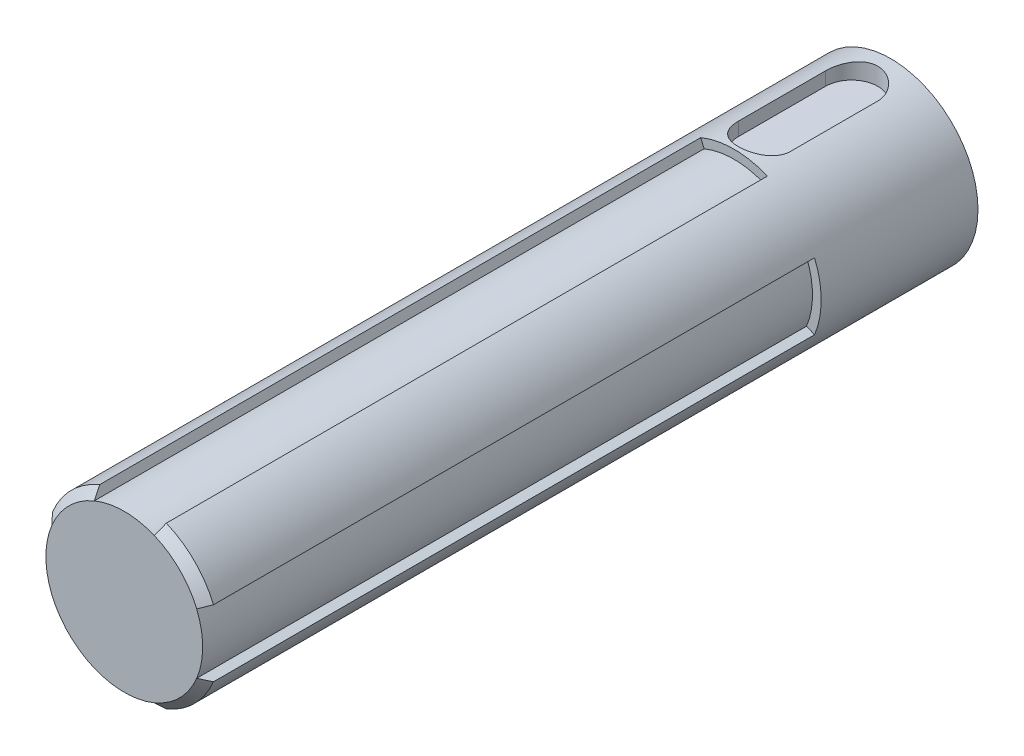
ISO-10303-21;
HEADER;
FILE_DESCRIPTION(('STEP AP214'),'2;1');
FILE_NAME('part.step','',(''),(''),'','','');
FILE_SCHEMA(('AUTOMOTIVE_DESIGN { 1 0 10303 214 1 1 1 1 }'));
ENDSEC;
DATA;
#1=APPLICATION_CONTEXT('core data for automotive mechanical design processes');
#2=APPLICATION_PROTOCOL_DEFINITION('international standard','automotive_design',2000,#1);
#3=PRODUCT_CONTEXT('',#1,'mechanical');
#4=PRODUCT('Part','Part','',(#3));
#5=PRODUCT_RELATED_PRODUCT_CATEGORY('part','',(#4));
#6=PRODUCT_DEFINITION_FORMATION('','',#4);
#7=PRODUCT_DEFINITION_CONTEXT('part definition',#1,'design');
#8=PRODUCT_DEFINITION('design','',#6,#7);
#9=PRODUCT_DEFINITION_SHAPE('','',#8);
#10=(LENGTH_UNIT() NAMED_UNIT(*) SI_UNIT(.MILLI.,.METRE.));
#11=(NAMED_UNIT(*) PLANE_ANGLE_UNIT() SI_UNIT($,.RADIAN.));
#12=(NAMED_UNIT(*) SI_UNIT($,.STERADIAN.) SOLID_ANGLE_UNIT());
#13=UNCERTAINTY_MEASURE_WITH_UNIT(LENGTH_MEASURE(1.E-05),#10,'distance_accuracy_value','');
#14=(GEOMETRIC_REPRESENTATION_CONTEXT(3) GLOBAL_UNCERTAINTY_ASSIGNED_CONTEXT((#13)) GLOBAL_UNIT_ASSIGNED_CONTEXT((#10,
#11,#12)) REPRESENTATION_CONTEXT('',''));
#15=CARTESIAN_POINT('',(0.,0.,0.));
#16=DIRECTION('',(0.,0.,1.));
#17=DIRECTION('',(1.,0.,0.));
#18=AXIS2_PLACEMENT_3D('',#15,#16,#17);
#19=CARTESIAN_POINT('',(0.,0.,88.));
#20=DIRECTION('',(0.,0.,-1.));
#21=DIRECTION('',(-1.,0.,0.));
#22=AXIS2_PLACEMENT_3D('',#19,#20,#21);
#23=CYLINDRICAL_SURFACE('',#22,10.);
#24=DIRECTION('',(0.,0.,-1.));
#25=VECTOR('',#24,1.);
#26=CARTESIAN_POINT('',(-3.,9.53939201416945,88.));
#27=LINE('',#26,#25);
#28=CARTESIAN_POINT('',(-3.,9.53939201416945,14.5));
#29=VERTEX_POINT('',#28);
#30=CARTESIAN_POINT('',(-3.,9.53939201416945,4.5));
#31=VERTEX_POINT('',#30);
#32=EDGE_CURVE('E11',#29,#31,#27,.T.);
#33=ORIENTED_EDGE('',*,*,#32,.T.);
#34=CARTESIAN_POINT('',(-3.,9.53939201416945,4.5));
#35=CARTESIAN_POINT('',(-3.00001027845728,9.53938054248206,4.4176644791773));
#36=CARTESIAN_POINT('',(-2.99661062684472,9.54045772064378,4.33533554493678));
#37=CARTESIAN_POINT('',(-2.98307142899347,9.54470412105986,4.17130604723454));
#38=CARTESIAN_POINT('',(-2.97293339805418,9.54787287296848,4.08960534667564));
#39=CARTESIAN_POINT('',(-2.94603140625045,9.55620668351003,3.92761508432682));
#40=CARTESIAN_POINT('',(-2.92928426957737,9.56136667250114,3.84732247595697));
#41=CARTESIAN_POINT('',(-2.88932853030395,9.57351626651178,3.68852415586577));
#42=CARTESIAN_POINT('',(-2.86611975872641,9.58050591937827,3.6100184909326));
#43=CARTESIAN_POINT('',(-2.78708584446024,9.60391637654136,3.37805061200985));
#44=CARTESIAN_POINT('',(-2.72181852542972,9.6227900783039,3.22793156116698));
#45=CARTESIAN_POINT('',(-2.56815043531276,9.66493213967819,2.94077395602096));
#46=CARTESIAN_POINT('',(-2.4797388992416,9.6882025429064,2.80374152923783));
#47=CARTESIAN_POINT('',(-2.27929879634442,9.73733650515374,2.54227701205217));
#48=CARTESIAN_POINT('',(-2.16666914746584,9.76325505469874,2.41831512593909));
#49=CARTESIAN_POINT('',(-1.92227736150433,9.81429628475077,2.19072638516124));
#50=CARTESIAN_POINT('',(-1.79051199848164,9.8394188301941,2.08710296613899));
#51=CARTESIAN_POINT('',(-1.50821997465697,9.88666477976534,1.90107313490544));
#52=CARTESIAN_POINT('',(-1.35736167401016,9.90871541546877,1.81914982021738));
#53=CARTESIAN_POINT('',(-1.04324233568303,9.94668940088144,1.68202299599707));
#54=CARTESIAN_POINT('',(-0.879984508687984,9.96261433032402,1.62681259663205));
#55=CARTESIAN_POINT('',(-0.550649404820601,9.98615279768397,1.546240448209));
#56=CARTESIAN_POINT('',(-0.384786253016203,9.99399098526792,1.52007029648238));
#57=CARTESIAN_POINT('',(-0.0508471415689274,10.0012640407204,1.49576530485396));
#58=CARTESIAN_POINT('',(0.11722839312534,10.0007004995012,1.49762515732182));
#59=CARTESIAN_POINT('',(0.445143199271825,9.99139205125586,1.52878582069144));
#60=CARTESIAN_POINT('',(0.605074290763029,9.98290831016512,1.55721069080811));
#61=CARTESIAN_POINT('',(0.917780104370314,9.95903027401822,1.63926326962549));
#62=CARTESIAN_POINT('',(1.07055445110879,9.94363561692558,1.69289229868267));
#63=CARTESIAN_POINT('',(1.36669563173912,9.90730429851782,1.82442444352475));
#64=CARTESIAN_POINT('',(1.50993201207613,9.88630511384915,1.9026032887761));
#65=CARTESIAN_POINT('',(1.781531059161,9.84099249303646,2.0807971800344));
#66=CARTESIAN_POINT('',(1.9098903832325,9.81667831471806,2.1808171189407));
#67=CARTESIAN_POINT('',(2.15330901082205,9.7662334714278,2.40438397618464));
#68=CARTESIAN_POINT('',(2.26766702955975,9.74006890899097,2.52868772752621));
#69=CARTESIAN_POINT('',(2.47413538985067,9.68968430229327,2.79499484685111));
#70=CARTESIAN_POINT('',(2.5662392402618,9.66546482675133,2.93700336072978));
#71=CARTESIAN_POINT('',(2.72632814481701,9.62154457591303,3.23656185689986));
#72=CARTESIAN_POINT('',(2.79406012682263,9.60189192491895,3.39425435918714));
#73=CARTESIAN_POINT('',(2.90171772009404,9.56991327306402,3.71944900796315));
#74=CARTESIAN_POINT('',(2.94168586436072,9.55757606951749,3.88693572142869));
#75=CARTESIAN_POINT('',(2.97802407180159,9.54628064650011,4.1299897781404));
#76=CARTESIAN_POINT('',(2.98626405978017,9.54370312550533,4.20378146835922));
#77=CARTESIAN_POINT('',(2.99724711229708,9.54025857223564,4.35170295819904));
#78=CARTESIAN_POINT('',(2.99999825936538,9.53938902493287,4.42583209932769));
#79=CARTESIAN_POINT('',(3.,9.53939201416945,4.5));
#80=B_SPLINE_CURVE_WITH_KNOTS('',3,(#34,#35,#36,#37,#38,#39,#40,#41,#42,#43,#44,#45,#46,#47,#48,
#49,#50,#51,#52,#53,#54,#55,#56,#57,#58,#59,#60,#61,#62,#63,#64,#65,#66,#67,#68,#69,#70,#71,#72,
#73,#74,#75,#76,#77,#78,#79),.UNSPECIFIED.,.F.,.F.,(4,2,2,2,2,2,2,2,2,2,2,2,2,2,2,2,2,2,2,2,2,2,
4),(0.,0.246918142439468,0.493780777706086,0.740019009623011,0.986263681482025,1.47813347402025,
1.97023245590779,2.47635119822766,2.98255536239033,3.4992281062007,4.01576751791672,
4.51753600864764,5.01920948804101,5.50490358251093,5.99062312360831,6.48200583350621,
6.97349873739169,7.48389234847122,7.99443465298715,8.51013494368214,9.02504345105574,
9.24774267716777,9.47011372732391),.UNSPECIFIED.);
#81=CARTESIAN_POINT('',(3.,9.53939201416945,4.5));
#82=VERTEX_POINT('',#81);
#83=EDGE_CURVE('E329',#31,#82,#80,.T.);
#84=ORIENTED_EDGE('',*,*,#83,.T.);
#85=DIRECTION('',(0.,0.,-1.));
#86=VECTOR('',#85,1.);
#87=CARTESIAN_POINT('',(3.,9.53939201416945,88.));
#88=LINE('',#87,#86);
#89=CARTESIAN_POINT('',(3.,9.53939201416945,14.5));
#90=VERTEX_POINT('',#89);
#91=EDGE_CURVE('E43',#82,#90,#88,.F.);
#92=ORIENTED_EDGE('',*,*,#91,.T.);
#93=CARTESIAN_POINT('',(3.,9.53939201416945,14.5));
#94=CARTESIAN_POINT('',(3.00001027845728,9.53938054248206,14.5823355208227));
#95=CARTESIAN_POINT('',(2.99661062684472,9.54045772064378,14.6646644550632));
#96=CARTESIAN_POINT('',(2.98307142899347,9.54470412105986,14.8286939527655));
#97=CARTESIAN_POINT('',(2.97293339805418,9.54787287296848,14.9103946533244));
#98=CARTESIAN_POINT('',(2.94603140625045,9.55620668351003,15.0723849156732));
#99=CARTESIAN_POINT('',(2.92928426957737,9.56136667250114,15.152677524043));
#100=CARTESIAN_POINT('',(2.88932853030395,9.57351626651178,15.3114758441342));
#101=CARTESIAN_POINT('',(2.86611975872641,9.58050591937827,15.3899815090674));
#102=CARTESIAN_POINT('',(2.78708584446024,9.60391637654136,15.6219493879901));
#103=CARTESIAN_POINT('',(2.72181852542972,9.6227900783039,15.772068438833));
#104=CARTESIAN_POINT('',(2.56815043531276,9.66493213967819,16.059226043979));
#105=CARTESIAN_POINT('',(2.4797388992416,9.6882025429064,16.1962584707622));
#106=CARTESIAN_POINT('',(2.27929879634442,9.73733650515374,16.4577229879478));
#107=CARTESIAN_POINT('',(2.16666914746584,9.76325505469873,16.5816848740609));
#108=CARTESIAN_POINT('',(1.92227736150433,9.81429628475077,16.8092736148388));
#109=CARTESIAN_POINT('',(1.79051199848164,9.8394188301941,16.912897033861));
#110=CARTESIAN_POINT('',(1.50821997465697,9.88666477976534,17.0989268650946));
#111=CARTESIAN_POINT('',(1.35736167401016,9.90871541546877,17.1808501797826));
#112=CARTESIAN_POINT('',(1.04324233568303,9.94668940088144,17.3179770040029));
#113=CARTESIAN_POINT('',(0.879984508687985,9.96261433032402,17.3731874033679));
#114=CARTESIAN_POINT('',(0.550649404820602,9.98615279768397,17.453759551791));
#115=CARTESIAN_POINT('',(0.384786253016203,9.99399098526792,17.4799297035176));
#116=CARTESIAN_POINT('',(0.0508471415689279,10.0012640407204,17.504234695146));
#117=CARTESIAN_POINT('',(-0.117228393125339,10.0007004995012,17.5023748426782));
#118=CARTESIAN_POINT('',(-0.445143199271824,9.99139205125586,17.4712141793086));
#119=CARTESIAN_POINT('',(-0.605074290763027,9.98290831016512,17.4427893091919));
#120=CARTESIAN_POINT('',(-0.917780104370312,9.95903027401822,17.3607367303745));
#121=CARTESIAN_POINT('',(-1.07055445110879,9.94363561692558,17.3071077013173));
#122=CARTESIAN_POINT('',(-1.36669563173912,9.90730429851782,17.1755755564753));
#123=CARTESIAN_POINT('',(-1.50993201207612,9.88630511384915,17.0973967112239));
#124=CARTESIAN_POINT('',(-1.781531059161,9.84099249303646,16.9192028199656));
#125=CARTESIAN_POINT('',(-1.9098903832325,9.81667831471806,16.8191828810593));
#126=CARTESIAN_POINT('',(-2.15330901082205,9.7662334714278,16.5956160238154));
#127=CARTESIAN_POINT('',(-2.26766702955975,9.74006890899097,16.4713122724738));
#128=CARTESIAN_POINT('',(-2.47413538985067,9.68968430229327,16.2050051531489));
#129=CARTESIAN_POINT('',(-2.5662392402618,9.66546482675134,16.0629966392702));
#130=CARTESIAN_POINT('',(-2.72632814481701,9.62154457591303,15.7634381431001));
#131=CARTESIAN_POINT('',(-2.79406012682262,9.60189192491895,15.6057456408129));
#132=CARTESIAN_POINT('',(-2.90171772009404,9.56991327306402,15.2805509920369));
#133=CARTESIAN_POINT('',(-2.94168586436072,9.55757606951749,15.1130642785713));
#134=CARTESIAN_POINT('',(-2.97802407180159,9.54628064650011,14.8700102218596));
#135=CARTESIAN_POINT('',(-2.98626405978017,9.54370312550533,14.7962185316408));
#136=CARTESIAN_POINT('',(-2.99724711229708,9.54025857223564,14.648297041801));
#137=CARTESIAN_POINT('',(-2.99999825936538,9.53938902493288,14.5741679006723));
#138=CARTESIAN_POINT('',(-3.,9.53939201416945,14.5));
#139=B_SPLINE_CURVE_WITH_KNOTS('',3,(#93,#94,#95,#96,#97,#98,#99,#100,#101,#102,#103,#104,#105,
#106,#107,#108,#109,#110,#111,#112,#113,#114,#115,#116,#117,#118,#119,#120,#121,#122,#123,#124,
#125,#126,#127,#128,#129,#130,#131,#132,#133,#134,#135,#136,#137,#138),.UNSPECIFIED.,.F.,.F.,(4,
2,2,2,2,2,2,2,2,2,2,2,2,2,2,2,2,2,2,2,2,2,4),(0.,0.246918142439467,0.493780777706085,
0.740019009623012,0.986263681482025,1.47813347402025,1.97023245590779,2.47635119822766,
2.98255536239033,3.4992281062007,4.01576751791672,4.51753600864764,5.01920948804101,
5.50490358251092,5.99062312360831,6.48200583350621,6.97349873739169,7.48389234847122,
7.99443465298715,8.51013494368214,9.02504345105574,9.24774267716777,9.47011372732391),.UNSPECIFIED.);
#140=EDGE_CURVE('E50',#90,#29,#139,.T.);
#141=ORIENTED_EDGE('',*,*,#140,.T.);
#142=EDGE_LOOP('',(#33,#84,#92,#141));
#143=FACE_BOUND('',#142,.T.);
#144=CARTESIAN_POINT('',(0.,0.,18.));
#145=DIRECTION('',(0.,0.,1.));
#146=DIRECTION('',(1.,0.,0.));
#147=AXIS2_PLACEMENT_3D('',#144,#145,#146);
#148=CIRCLE('',#147,10.);
#149=CARTESIAN_POINT('',(9.23879532511286,-3.8268343236509,18.));
#150=VERTEX_POINT('',#149);
#151=CARTESIAN_POINT('',(9.23879532511286,3.8268343236509,18.));
#152=VERTEX_POINT('',#151);
#153=EDGE_CURVE('E208',#150,#152,#148,.T.);
#154=ORIENTED_EDGE('',*,*,#153,.F.);
#155=DIRECTION('',(0.,0.,1.));
#156=VECTOR('',#155,1.);
#157=CARTESIAN_POINT('',(9.23879532511286,-3.8268343236509,18.));
#158=LINE('',#157,#156);
#159=CARTESIAN_POINT('',(9.23879532511286,-3.8268343236509,87.));
#160=VERTEX_POINT('',#159);
#161=EDGE_CURVE('E216',#150,#160,#158,.T.);
#162=ORIENTED_EDGE('',*,*,#161,.T.);
#163=CARTESIAN_POINT('',(0.,0.,87.));
#164=DIRECTION('',(0.,0.,1.));
#165=DIRECTION('',(1.,0.,0.));
#166=AXIS2_PLACEMENT_3D('',#163,#164,#165);
#167=CIRCLE('',#166,10.);
#168=CARTESIAN_POINT('',(3.82683432365084,-9.23879532511289,87.));
#169=VERTEX_POINT('',#168);
#170=EDGE_CURVE('E307',#160,#169,#167,.F.);
#171=ORIENTED_EDGE('',*,*,#170,.T.);
#172=DIRECTION('',(0.,0.,1.));
#173=VECTOR('',#172,1.);
#174=CARTESIAN_POINT('',(3.82683432365084,-9.23879532511289,18.));
#175=LINE('',#174,#173);
#176=CARTESIAN_POINT('',(3.82683432365084,-9.23879532511289,18.));
#177=VERTEX_POINT('',#176);
#178=EDGE_CURVE('E248',#177,#169,#175,.T.);
#179=ORIENTED_EDGE('',*,*,#178,.F.);
#180=CARTESIAN_POINT('',(0.,0.,18.));
#181=DIRECTION('',(0.,0.,1.));
#182=DIRECTION('',(1.,0.,0.));
#183=AXIS2_PLACEMENT_3D('',#180,#181,#182);
#184=CIRCLE('',#183,10.);
#185=CARTESIAN_POINT('',(-3.82683432365084,-9.23879532511289,18.));
#186=VERTEX_POINT('',#185);
#187=EDGE_CURVE('E231',#186,#177,#184,.T.);
#188=ORIENTED_EDGE('',*,*,#187,.F.);
#189=DIRECTION('',(0.,0.,1.));
#190=VECTOR('',#189,1.);
#191=CARTESIAN_POINT('',(-3.82683432365084,-9.23879532511289,18.));
#192=LINE('',#191,#190);
#193=CARTESIAN_POINT('',(-3.82683432365084,-9.23879532511289,87.));
#194=VERTEX_POINT('',#193);
#195=EDGE_CURVE('E240',#186,#194,#192,.T.);
#196=ORIENTED_EDGE('',*,*,#195,.T.);
#197=CARTESIAN_POINT('',(-9.23879532511286,-3.8268343236509,87.));
#198=VERTEX_POINT('',#197);
#199=EDGE_CURVE('E476',#194,#198,#167,.F.);
#200=ORIENTED_EDGE('',*,*,#199,.T.);
#201=DIRECTION('',(0.,0.,1.));
#202=VECTOR('',#201,1.);
#203=CARTESIAN_POINT('',(-9.23879532511286,-3.8268343236509,18.));
#204=LINE('',#203,#202);
#205=CARTESIAN_POINT('',(-9.23879532511286,-3.8268343236509,18.));
#206=VERTEX_POINT('',#205);
#207=EDGE_CURVE('E270',#206,#198,#204,.T.);
#208=ORIENTED_EDGE('',*,*,#207,.F.);
#209=CARTESIAN_POINT('',(0.,0.,18.));
#210=DIRECTION('',(0.,0.,1.));
#211=DIRECTION('',(1.,0.,0.));
#212=AXIS2_PLACEMENT_3D('',#209,#210,#211);
#213=CIRCLE('',#212,10.);
#214=CARTESIAN_POINT('',(-9.23879532511286,3.8268343236509,18.));
#215=VERTEX_POINT('',#214);
#216=EDGE_CURVE('E255',#215,#206,#213,.T.);
#217=ORIENTED_EDGE('',*,*,#216,.F.);
#218=DIRECTION('',(0.,0.,1.));
#219=VECTOR('',#218,1.);
#220=CARTESIAN_POINT('',(-9.23879532511286,3.8268343236509,18.));
#221=LINE('',#220,#219);
#222=CARTESIAN_POINT('',(-9.23879532511286,3.8268343236509,87.));
#223=VERTEX_POINT('',#222);
#224=EDGE_CURVE('E263',#215,#223,#221,.T.);
#225=ORIENTED_EDGE('',*,*,#224,.T.);
#226=CARTESIAN_POINT('',(-3.82683432365084,9.23879532511289,87.));
#227=VERTEX_POINT('',#226);
#228=EDGE_CURVE('E301',#223,#227,#167,.F.);
#229=ORIENTED_EDGE('',*,*,#228,.T.);
#230=DIRECTION('',(0.,0.,1.));
#231=VECTOR('',#230,1.);
#232=CARTESIAN_POINT('',(-3.82683432365084,9.23879532511289,18.));
#233=LINE('',#232,#231);
#234=CARTESIAN_POINT('',(-3.82683432365084,9.23879532511289,18.));
#235=VERTEX_POINT('',#234);
#236=EDGE_CURVE('E290',#235,#227,#233,.T.);
#237=ORIENTED_EDGE('',*,*,#236,.F.);
#238=CARTESIAN_POINT('',(0.,0.,18.));
#239=DIRECTION('',(0.,0.,1.));
#240=DIRECTION('',(1.,0.,0.));
#241=AXIS2_PLACEMENT_3D('',#238,#239,#240);
#242=CIRCLE('',#241,10.);
#243=CARTESIAN_POINT('',(3.82683432365084,9.23879532511289,18.));
#244=VERTEX_POINT('',#243);
#245=EDGE_CURVE('E276',#244,#235,#242,.T.);
#246=ORIENTED_EDGE('',*,*,#245,.F.);
#247=DIRECTION('',(0.,0.,1.));
#248=VECTOR('',#247,1.);
#249=CARTESIAN_POINT('',(3.82683432365084,9.23879532511289,18.));
#250=LINE('',#249,#248);
#251=CARTESIAN_POINT('',(3.82683432365084,9.23879532511289,87.));
#252=VERTEX_POINT('',#251);
#253=EDGE_CURVE('E283',#244,#252,#250,.T.);
#254=ORIENTED_EDGE('',*,*,#253,.T.);
#255=CARTESIAN_POINT('',(9.23879532511286,3.8268343236509,87.));
#256=VERTEX_POINT('',#255);
#257=EDGE_CURVE('E303',#252,#256,#167,.F.);
#258=ORIENTED_EDGE('',*,*,#257,.T.);
#259=DIRECTION('',(0.,0.,1.));
#260=VECTOR('',#259,1.);
#261=CARTESIAN_POINT('',(9.23879532511286,3.8268343236509,18.));
#262=LINE('',#261,#260);
#263=EDGE_CURVE('E224',#152,#256,#262,.T.);
#264=ORIENTED_EDGE('',*,*,#263,.F.);
#265=EDGE_LOOP('',(#154,#162,#171,#179,#188,#196,#200,#208,#217,#225,#229,#237,#246,#254,#258,#264));
#266=FACE_BOUND('',#265,.T.);
#267=CARTESIAN_POINT('',(0.,0.,0.));
#268=DIRECTION('',(0.,0.,1.));
#269=DIRECTION('',(1.,0.,0.));
#270=AXIS2_PLACEMENT_3D('',#267,#268,#269);
#271=CIRCLE('',#270,10.);
#272=CARTESIAN_POINT('',(10.,0.,0.));
#273=VERTEX_POINT('',#272);
#274=EDGE_CURVE('E287',#273,#273,#271,.T.);
#275=ORIENTED_EDGE('',*,*,#274,.T.);
#276=EDGE_LOOP('',(#275));
#277=FACE_BOUND('',#276,.T.);
#278=ADVANCED_FACE('F35',(#143,#266,#277),#23,.T.);
#279=CARTESIAN_POINT('',(0.,0.,88.));
#280=DIRECTION('',(0.,0.,-1.));
#281=DIRECTION('',(-1.,0.,0.));
#282=AXIS2_PLACEMENT_3D('',#279,#280,#281);
#283=CONICAL_SURFACE('',#282,8.99999999999999,0.785398163397443);
#284=CARTESIAN_POINT('',(0.,0.,88.));
#285=DIRECTION('',(0.,0.,1.));
#286=DIRECTION('',(1.,0.,0.));
#287=AXIS2_PLACEMENT_3D('',#284,#285,#286);
#288=CIRCLE('',#287,8.99999999999999);
#289=CARTESIAN_POINT('',(8.31491579260157,3.44415089128581,88.));
#290=VERTEX_POINT('',#289);
#291=CARTESIAN_POINT('',(3.44415089128575,8.3149157926016,88.));
#292=VERTEX_POINT('',#291);
#293=EDGE_CURVE('E297',#290,#292,#288,.T.);
#294=ORIENTED_EDGE('',*,*,#293,.F.);
#295=DIRECTION('',(-0.653281482438185,-0.270598050073097,0.707106781186551));
#296=VECTOR('',#295,1.);
#297=CARTESIAN_POINT('',(0.,0.,97.0000000000001));
#298=LINE('',#297,#296);
#299=EDGE_CURVE('E324',#290,#256,#298,.F.);
#300=ORIENTED_EDGE('',*,*,#299,.T.);
#301=ORIENTED_EDGE('',*,*,#257,.F.);
#302=DIRECTION('',(-0.270598050073093,-0.653281482438187,0.707106781186551));
#303=VECTOR('',#302,1.);
#304=CARTESIAN_POINT('',(0.,0.,97.0000000000001));
#305=LINE('',#304,#303);
#306=EDGE_CURVE('E310',#292,#252,#305,.F.);
#307=ORIENTED_EDGE('',*,*,#306,.F.);
#308=EDGE_LOOP('',(#294,#300,#301,#307));
#309=FACE_BOUND('',#308,.T.);
#310=ADVANCED_FACE('F428',(#309),#283,.T.);
#311=ORIENTED_EDGE('',*,*,#199,.F.);
#312=DIRECTION('',(-0.270598050073093,-0.653281482438187,-0.707106781186551));
#313=VECTOR('',#312,1.);
#314=CARTESIAN_POINT('',(0.,0.,97.0000000000001));
#315=LINE('',#314,#313);
#316=CARTESIAN_POINT('',(-3.44415089128575,-8.3149157926016,88.));
#317=VERTEX_POINT('',#316);
#318=EDGE_CURVE('E321',#194,#317,#315,.F.);
#319=ORIENTED_EDGE('',*,*,#318,.T.);
#320=CARTESIAN_POINT('',(-8.31491579260157,-3.44415089128581,88.));
#321=VERTEX_POINT('',#320);
#322=EDGE_CURVE('E452',#321,#317,#288,.T.);
#323=ORIENTED_EDGE('',*,*,#322,.F.);
#324=DIRECTION('',(-0.653281482438185,-0.270598050073098,-0.707106781186551));
#325=VECTOR('',#324,1.);
#326=CARTESIAN_POINT('',(0.,0.,97.0000000000001));
#327=LINE('',#326,#325);
#328=EDGE_CURVE('E312',#198,#321,#327,.F.);
#329=ORIENTED_EDGE('',*,*,#328,.F.);
#330=EDGE_LOOP('',(#311,#319,#323,#329));
#331=FACE_BOUND('',#330,.T.);
#332=ADVANCED_FACE('F435',(#331),#283,.T.);
#333=ORIENTED_EDGE('',*,*,#228,.F.);
#334=DIRECTION('',(-0.653281482438185,0.270598050073098,-0.707106781186551));
#335=VECTOR('',#334,1.);
#336=CARTESIAN_POINT('',(0.,0.,97.0000000000001));
#337=LINE('',#336,#335);
#338=CARTESIAN_POINT('',(-8.31491579260157,3.44415089128581,88.));
#339=VERTEX_POINT('',#338);
#340=EDGE_CURVE('E315',#223,#339,#337,.F.);
#341=ORIENTED_EDGE('',*,*,#340,.T.);
#342=CARTESIAN_POINT('',(-3.44415089128576,8.3149157926016,88.));
#343=VERTEX_POINT('',#342);
#344=EDGE_CURVE('E302',#343,#339,#288,.T.);
#345=ORIENTED_EDGE('',*,*,#344,.F.);
#346=DIRECTION('',(0.270598050073093,-0.653281482438187,0.707106781186551));
#347=VECTOR('',#346,1.);
#348=CARTESIAN_POINT('',(0.,0.,97.0000000000001));
#349=LINE('',#348,#347);
#350=EDGE_CURVE('E306',#343,#227,#349,.F.);
#351=ORIENTED_EDGE('',*,*,#350,.T.);
#352=EDGE_LOOP('',(#333,#341,#345,#351));
#353=FACE_BOUND('',#352,.T.);
#354=ADVANCED_FACE('F420',(#353),#283,.T.);
#355=CARTESIAN_POINT('',(0.,0.,88.));
#356=DIRECTION('',(0.,0.,1.));
#357=DIRECTION('',(1.,0.,0.));
#358=AXIS2_PLACEMENT_3D('',#355,#356,#357);
#359=PLANE('',#358);
#360=EDGE_CURVE('E298',#292,#343,#288,.T.);
#361=ORIENTED_EDGE('',*,*,#360,.T.);
#362=ORIENTED_EDGE('',*,*,#344,.T.);
#363=CARTESIAN_POINT('',(0.,0.,88.));
#364=DIRECTION('',(0.,0.,1.));
#365=DIRECTION('',(1.,0.,0.));
#366=AXIS2_PLACEMENT_3D('',#363,#364,#365);
#367=CIRCLE('',#366,8.99999999999999);
#368=EDGE_CURVE('E200',#339,#321,#367,.T.);
#369=ORIENTED_EDGE('',*,*,#368,.T.);
#370=ORIENTED_EDGE('',*,*,#322,.T.);
#371=CARTESIAN_POINT('',(0.,0.,88.));
#372=DIRECTION('',(0.,0.,1.));
#373=DIRECTION('',(1.,0.,0.));
#374=AXIS2_PLACEMENT_3D('',#371,#372,#373);
#375=CIRCLE('',#374,8.99999999999999);
#376=CARTESIAN_POINT('',(3.44415089128576,-8.3149157926016,88.));
#377=VERTEX_POINT('',#376);
#378=EDGE_CURVE('E232',#317,#377,#375,.T.);
#379=ORIENTED_EDGE('',*,*,#378,.T.);
#380=CARTESIAN_POINT('',(8.31491579260157,-3.44415089128581,88.));
#381=VERTEX_POINT('',#380);
#382=EDGE_CURVE('E450',#377,#381,#288,.T.);
#383=ORIENTED_EDGE('',*,*,#382,.T.);
#384=CARTESIAN_POINT('',(0.,0.,88.));
#385=DIRECTION('',(0.,0.,1.));
#386=DIRECTION('',(1.,0.,0.));
#387=AXIS2_PLACEMENT_3D('',#384,#385,#386);
#388=CIRCLE('',#387,8.99999999999999);
#389=EDGE_CURVE('E209',#381,#290,#388,.T.);
#390=ORIENTED_EDGE('',*,*,#389,.T.);
#391=ORIENTED_EDGE('',*,*,#293,.T.);
#392=EDGE_LOOP('',(#361,#362,#369,#370,#379,#383,#390,#391));
#393=FACE_BOUND('',#392,.T.);
#394=ADVANCED_FACE('F417',(#393),#359,.T.);
#395=CARTESIAN_POINT('',(0.,0.,0.));
#396=DIRECTION('',(0.,0.,1.));
#397=DIRECTION('',(1.,0.,0.));
#398=AXIS2_PLACEMENT_3D('',#395,#396,#397);
#399=PLANE('',#398);
#400=ORIENTED_EDGE('',*,*,#274,.F.);
#401=EDGE_LOOP('',(#400));
#402=FACE_BOUND('',#401,.T.);
#403=ADVANCED_FACE('F419',(#402),#399,.F.);
#404=DIRECTION('',(-0.653281482438185,0.270598050073098,0.707106781186551));
#405=VECTOR('',#404,1.);
#406=CARTESIAN_POINT('',(0.,0.,97.0000000000001));
#407=LINE('',#406,#405);
#408=EDGE_CURVE('E327',#381,#160,#407,.F.);
#409=ORIENTED_EDGE('',*,*,#408,.F.);
#410=ORIENTED_EDGE('',*,*,#382,.F.);
#411=DIRECTION('',(0.270598050073093,-0.653281482438187,-0.707106781186551));
#412=VECTOR('',#411,1.);
#413=CARTESIAN_POINT('',(0.,0.,97.0000000000001));
#414=LINE('',#413,#412);
#415=EDGE_CURVE('E318',#169,#377,#414,.F.);
#416=ORIENTED_EDGE('',*,*,#415,.F.);
#417=ORIENTED_EDGE('',*,*,#170,.F.);
#418=EDGE_LOOP('',(#409,#410,#416,#417));
#419=FACE_BOUND('',#418,.T.);
#420=ADVANCED_FACE('F37',(#419),#283,.T.);
#421=CARTESIAN_POINT('',(0.,0.,18.));
#422=DIRECTION('',(0.923879532511289,-0.382683432365084,0.));
#423=DIRECTION('',(0.382683432365084,0.923879532511289,0.));
#424=AXIS2_PLACEMENT_3D('',#421,#422,#423);
#425=PLANE('',#424);
#426=ORIENTED_EDGE('',*,*,#306,.T.);
#427=ORIENTED_EDGE('',*,*,#253,.F.);
#428=DIRECTION('',(0.382683432365084,0.923879532511289,0.));
#429=VECTOR('',#428,1.);
#430=CARTESIAN_POINT('',(0.,0.,18.));
#431=LINE('',#430,#429);
#432=CARTESIAN_POINT('',(3.44415089128575,8.3149157926016,18.));
#433=VERTEX_POINT('',#432);
#434=EDGE_CURVE('E222',#433,#244,#431,.T.);
#435=ORIENTED_EDGE('',*,*,#434,.F.);
#436=DIRECTION('',(0.,0.,1.));
#437=VECTOR('',#436,1.);
#438=CARTESIAN_POINT('',(3.44415089128575,8.3149157926016,18.));
#439=LINE('',#438,#437);
#440=EDGE_CURVE('E284',#433,#292,#439,.T.);
#441=ORIENTED_EDGE('',*,*,#440,.T.);
#442=EDGE_LOOP('',(#426,#427,#435,#441));
#443=FACE_BOUND('',#442,.T.);
#444=ADVANCED_FACE('F409',(#443),#425,.F.);
#445=CARTESIAN_POINT('',(0.,0.,18.));
#446=DIRECTION('',(0.,0.,1.));
#447=DIRECTION('',(1.,0.,0.));
#448=AXIS2_PLACEMENT_3D('',#445,#446,#447);
#449=CYLINDRICAL_SURFACE('',#448,8.99999999999999);
#450=ORIENTED_EDGE('',*,*,#360,.F.);
#451=ORIENTED_EDGE('',*,*,#440,.F.);
#452=CARTESIAN_POINT('',(0.,0.,18.));
#453=DIRECTION('',(0.,0.,1.));
#454=DIRECTION('',(1.,0.,0.));
#455=AXIS2_PLACEMENT_3D('',#452,#453,#454);
#456=CIRCLE('',#455,8.99999999999999);
#457=CARTESIAN_POINT('',(-3.44415089128576,8.31491579260159,18.));
#458=VERTEX_POINT('',#457);
#459=EDGE_CURVE('E281',#433,#458,#456,.T.);
#460=ORIENTED_EDGE('',*,*,#459,.T.);
#461=DIRECTION('',(0.,0.,1.));
#462=VECTOR('',#461,1.);
#463=CARTESIAN_POINT('',(-3.44415089128576,8.31491579260159,18.));
#464=LINE('',#463,#462);
#465=EDGE_CURVE('E288',#458,#343,#464,.T.);
#466=ORIENTED_EDGE('',*,*,#465,.T.);
#467=EDGE_LOOP('',(#450,#451,#460,#466));
#468=FACE_BOUND('',#467,.T.);
#469=ADVANCED_FACE('F406',(#468),#449,.T.);
#470=CARTESIAN_POINT('',(0.,0.,18.));
#471=DIRECTION('',(0.923879532511289,0.382683432365084,0.));
#472=DIRECTION('',(-0.382683432365084,0.923879532511289,0.));
#473=AXIS2_PLACEMENT_3D('',#470,#471,#472);
#474=PLANE('',#473);
#475=ORIENTED_EDGE('',*,*,#465,.F.);
#476=DIRECTION('',(-0.382683432365084,0.923879532511289,0.));
#477=VECTOR('',#476,1.);
#478=CARTESIAN_POINT('',(0.,0.,18.));
#479=LINE('',#478,#477);
#480=EDGE_CURVE('E279',#458,#235,#479,.T.);
#481=ORIENTED_EDGE('',*,*,#480,.T.);
#482=ORIENTED_EDGE('',*,*,#236,.T.);
#483=ORIENTED_EDGE('',*,*,#350,.F.);
#484=EDGE_LOOP('',(#475,#481,#482,#483));
#485=FACE_BOUND('',#484,.T.);
#486=ADVANCED_FACE('F404',(#485),#474,.T.);
#487=CARTESIAN_POINT('',(0.,0.,18.));
#488=DIRECTION('',(0.,0.,1.));
#489=DIRECTION('',(1.,0.,0.));
#490=AXIS2_PLACEMENT_3D('',#487,#488,#489);
#491=PLANE('',#490);
#492=ORIENTED_EDGE('',*,*,#434,.T.);
#493=ORIENTED_EDGE('',*,*,#245,.T.);
#494=ORIENTED_EDGE('',*,*,#480,.F.);
#495=ORIENTED_EDGE('',*,*,#459,.F.);
#496=EDGE_LOOP('',(#492,#493,#494,#495));
#497=FACE_BOUND('',#496,.T.);
#498=ADVANCED_FACE('F400',(#497),#491,.T.);
#499=CARTESIAN_POINT('',(0.,0.,18.));
#500=DIRECTION('',(-0.382683432365091,-0.923879532511286,0.));
#501=DIRECTION('',(0.923879532511286,-0.382683432365091,0.));
#502=AXIS2_PLACEMENT_3D('',#499,#500,#501);
#503=PLANE('',#502);
#504=ORIENTED_EDGE('',*,*,#224,.F.);
#505=DIRECTION('',(0.923879532511286,-0.382683432365091,0.));
#506=VECTOR('',#505,1.);
#507=CARTESIAN_POINT('',(0.,0.,18.));
#508=LINE('',#507,#506);
#509=CARTESIAN_POINT('',(-8.31491579260157,3.44415089128581,18.));
#510=VERTEX_POINT('',#509);
#511=EDGE_CURVE('E252',#215,#510,#508,.T.);
#512=ORIENTED_EDGE('',*,*,#511,.T.);
#513=DIRECTION('',(0.,0.,1.));
#514=VECTOR('',#513,1.);
#515=CARTESIAN_POINT('',(-8.31491579260157,3.44415089128581,18.));
#516=LINE('',#515,#514);
#517=EDGE_CURVE('E243',#510,#339,#516,.T.);
#518=ORIENTED_EDGE('',*,*,#517,.T.);
#519=ORIENTED_EDGE('',*,*,#340,.F.);
#520=EDGE_LOOP('',(#504,#512,#518,#519));
#521=FACE_BOUND('',#520,.T.);
#522=ADVANCED_FACE('F393',(#521),#503,.T.);
#523=CARTESIAN_POINT('',(0.,0.,18.));
#524=DIRECTION('',(0.,0.,1.));
#525=DIRECTION('',(1.,0.,0.));
#526=AXIS2_PLACEMENT_3D('',#523,#524,#525);
#527=CYLINDRICAL_SURFACE('',#526,8.99999999999999);
#528=ORIENTED_EDGE('',*,*,#368,.F.);
#529=ORIENTED_EDGE('',*,*,#517,.F.);
#530=CARTESIAN_POINT('',(0.,0.,18.));
#531=DIRECTION('',(0.,0.,1.));
#532=DIRECTION('',(1.,0.,0.));
#533=AXIS2_PLACEMENT_3D('',#530,#531,#532);
#534=CIRCLE('',#533,8.99999999999999);
#535=CARTESIAN_POINT('',(-8.31491579260157,-3.44415089128581,18.));
#536=VERTEX_POINT('',#535);
#537=EDGE_CURVE('E261',#510,#536,#534,.T.);
#538=ORIENTED_EDGE('',*,*,#537,.T.);
#539=DIRECTION('',(0.,0.,1.));
#540=VECTOR('',#539,1.);
#541=CARTESIAN_POINT('',(-8.31491579260157,-3.44415089128581,18.));
#542=LINE('',#541,#540);
#543=EDGE_CURVE('E268',#536,#321,#542,.T.);
#544=ORIENTED_EDGE('',*,*,#543,.T.);
#545=EDGE_LOOP('',(#528,#529,#538,#544));
#546=FACE_BOUND('',#545,.T.);
#547=ADVANCED_FACE('F390',(#546),#527,.T.);
#548=CARTESIAN_POINT('',(0.,0.,18.));
#549=DIRECTION('',(0.382683432365091,-0.923879532511286,0.));
#550=DIRECTION('',(0.923879532511286,0.382683432365091,0.));
#551=AXIS2_PLACEMENT_3D('',#548,#549,#550);
#552=PLANE('',#551);
#553=ORIENTED_EDGE('',*,*,#328,.T.);
#554=ORIENTED_EDGE('',*,*,#543,.F.);
#555=DIRECTION('',(0.923879532511286,0.382683432365091,0.));
#556=VECTOR('',#555,1.);
#557=CARTESIAN_POINT('',(0.,0.,18.));
#558=LINE('',#557,#556);
#559=EDGE_CURVE('E258',#206,#536,#558,.T.);
#560=ORIENTED_EDGE('',*,*,#559,.F.);
#561=ORIENTED_EDGE('',*,*,#207,.T.);
#562=EDGE_LOOP('',(#553,#554,#560,#561));
#563=FACE_BOUND('',#562,.T.);
#564=ADVANCED_FACE('F388',(#563),#552,.F.);
#565=CARTESIAN_POINT('',(0.,0.,18.));
#566=DIRECTION('',(0.,0.,1.));
#567=DIRECTION('',(1.,0.,0.));
#568=AXIS2_PLACEMENT_3D('',#565,#566,#567);
#569=PLANE('',#568);
#570=ORIENTED_EDGE('',*,*,#511,.F.);
#571=ORIENTED_EDGE('',*,*,#216,.T.);
#572=ORIENTED_EDGE('',*,*,#559,.T.);
#573=ORIENTED_EDGE('',*,*,#537,.F.);
#574=EDGE_LOOP('',(#570,#571,#572,#573));
#575=FACE_BOUND('',#574,.T.);
#576=ADVANCED_FACE('F384',(#575),#569,.T.);
#577=CARTESIAN_POINT('',(0.,0.,18.));
#578=DIRECTION('',(0.923879532511289,-0.382683432365084,0.));
#579=DIRECTION('',(0.382683432365084,0.923879532511289,0.));
#580=AXIS2_PLACEMENT_3D('',#577,#578,#579);
#581=PLANE('',#580);
#582=ORIENTED_EDGE('',*,*,#195,.F.);
#583=DIRECTION('',(0.382683432365084,0.923879532511289,0.));
#584=VECTOR('',#583,1.);
#585=CARTESIAN_POINT('',(0.,0.,18.));
#586=LINE('',#585,#584);
#587=CARTESIAN_POINT('',(-3.44415089128575,-8.3149157926016,18.));
#588=VERTEX_POINT('',#587);
#589=EDGE_CURVE('E228',#186,#588,#586,.T.);
#590=ORIENTED_EDGE('',*,*,#589,.T.);
#591=DIRECTION('',(0.,0.,1.));
#592=VECTOR('',#591,1.);
#593=CARTESIAN_POINT('',(-3.44415089128575,-8.3149157926016,18.));
#594=LINE('',#593,#592);
#595=EDGE_CURVE('E219',#588,#317,#594,.T.);
#596=ORIENTED_EDGE('',*,*,#595,.T.);
#597=ORIENTED_EDGE('',*,*,#318,.F.);
#598=EDGE_LOOP('',(#582,#590,#596,#597));
#599=FACE_BOUND('',#598,.T.);
#600=ADVANCED_FACE('F377',(#599),#581,.T.);
#601=CARTESIAN_POINT('',(0.,0.,18.));
#602=DIRECTION('',(0.,0.,1.));
#603=DIRECTION('',(1.,0.,0.));
#604=AXIS2_PLACEMENT_3D('',#601,#602,#603);
#605=CYLINDRICAL_SURFACE('',#604,8.99999999999999);
#606=ORIENTED_EDGE('',*,*,#378,.F.);
#607=ORIENTED_EDGE('',*,*,#595,.F.);
#608=CARTESIAN_POINT('',(0.,0.,18.));
#609=DIRECTION('',(0.,0.,1.));
#610=DIRECTION('',(1.,0.,0.));
#611=AXIS2_PLACEMENT_3D('',#608,#609,#610);
#612=CIRCLE('',#611,8.99999999999999);
#613=CARTESIAN_POINT('',(3.44415089128576,-8.3149157926016,18.));
#614=VERTEX_POINT('',#613);
#615=EDGE_CURVE('E238',#588,#614,#612,.T.);
#616=ORIENTED_EDGE('',*,*,#615,.T.);
#617=DIRECTION('',(0.,0.,1.));
#618=VECTOR('',#617,1.);
#619=CARTESIAN_POINT('',(3.44415089128576,-8.3149157926016,18.));
#620=LINE('',#619,#618);
#621=EDGE_CURVE('E246',#614,#377,#620,.T.);
#622=ORIENTED_EDGE('',*,*,#621,.T.);
#623=EDGE_LOOP('',(#606,#607,#616,#622));
#624=FACE_BOUND('',#623,.T.);
#625=ADVANCED_FACE('F374',(#624),#605,.T.);
#626=CARTESIAN_POINT('',(0.,0.,18.));
#627=DIRECTION('',(0.923879532511289,0.382683432365084,0.));
#628=DIRECTION('',(-0.382683432365084,0.923879532511289,0.));
#629=AXIS2_PLACEMENT_3D('',#626,#627,#628);
#630=PLANE('',#629);
#631=ORIENTED_EDGE('',*,*,#415,.T.);
#632=ORIENTED_EDGE('',*,*,#621,.F.);
#633=DIRECTION('',(-0.382683432365084,0.923879532511289,0.));
#634=VECTOR('',#633,1.);
#635=CARTESIAN_POINT('',(0.,0.,18.));
#636=LINE('',#635,#634);
#637=EDGE_CURVE('E235',#177,#614,#636,.T.);
#638=ORIENTED_EDGE('',*,*,#637,.F.);
#639=ORIENTED_EDGE('',*,*,#178,.T.);
#640=EDGE_LOOP('',(#631,#632,#638,#639));
#641=FACE_BOUND('',#640,.T.);
#642=ADVANCED_FACE('F372',(#641),#630,.F.);
#643=CARTESIAN_POINT('',(0.,0.,18.));
#644=DIRECTION('',(0.,0.,1.));
#645=DIRECTION('',(1.,0.,0.));
#646=AXIS2_PLACEMENT_3D('',#643,#644,#645);
#647=PLANE('',#646);
#648=ORIENTED_EDGE('',*,*,#589,.F.);
#649=ORIENTED_EDGE('',*,*,#187,.T.);
#650=ORIENTED_EDGE('',*,*,#637,.T.);
#651=ORIENTED_EDGE('',*,*,#615,.F.);
#652=EDGE_LOOP('',(#648,#649,#650,#651));
#653=FACE_BOUND('',#652,.T.);
#654=ADVANCED_FACE('F368',(#653),#647,.T.);
#655=CARTESIAN_POINT('',(0.,0.,18.));
#656=DIRECTION('',(-0.382683432365091,-0.923879532511286,0.));
#657=DIRECTION('',(0.923879532511286,-0.382683432365091,0.));
#658=AXIS2_PLACEMENT_3D('',#655,#656,#657);
#659=PLANE('',#658);
#660=ORIENTED_EDGE('',*,*,#408,.T.);
#661=ORIENTED_EDGE('',*,*,#161,.F.);
#662=DIRECTION('',(0.923879532511286,-0.382683432365091,0.));
#663=VECTOR('',#662,1.);
#664=CARTESIAN_POINT('',(0.,0.,18.));
#665=LINE('',#664,#663);
#666=CARTESIAN_POINT('',(8.31491579260157,-3.44415089128581,18.));
#667=VERTEX_POINT('',#666);
#668=EDGE_CURVE('E205',#667,#150,#665,.T.);
#669=ORIENTED_EDGE('',*,*,#668,.F.);
#670=DIRECTION('',(0.,0.,1.));
#671=VECTOR('',#670,1.);
#672=CARTESIAN_POINT('',(8.31491579260157,-3.44415089128581,18.));
#673=LINE('',#672,#671);
#674=EDGE_CURVE('E220',#667,#381,#673,.T.);
#675=ORIENTED_EDGE('',*,*,#674,.T.);
#676=EDGE_LOOP('',(#660,#661,#669,#675));
#677=FACE_BOUND('',#676,.T.);
#678=ADVANCED_FACE('F362',(#677),#659,.F.);
#679=CARTESIAN_POINT('',(0.,0.,18.));
#680=DIRECTION('',(0.,0.,1.));
#681=DIRECTION('',(1.,0.,0.));
#682=AXIS2_PLACEMENT_3D('',#679,#680,#681);
#683=CYLINDRICAL_SURFACE('',#682,8.99999999999999);
#684=ORIENTED_EDGE('',*,*,#389,.F.);
#685=ORIENTED_EDGE('',*,*,#674,.F.);
#686=CARTESIAN_POINT('',(0.,0.,18.));
#687=DIRECTION('',(0.,0.,1.));
#688=DIRECTION('',(1.,0.,0.));
#689=AXIS2_PLACEMENT_3D('',#686,#687,#688);
#690=CIRCLE('',#689,8.99999999999999);
#691=CARTESIAN_POINT('',(8.31491579260157,3.44415089128581,18.));
#692=VERTEX_POINT('',#691);
#693=EDGE_CURVE('E214',#667,#692,#690,.T.);
#694=ORIENTED_EDGE('',*,*,#693,.T.);
#695=DIRECTION('',(0.,0.,1.));
#696=VECTOR('',#695,1.);
#697=CARTESIAN_POINT('',(8.31491579260157,3.44415089128581,18.));
#698=LINE('',#697,#696);
#699=EDGE_CURVE('E58',#692,#290,#698,.T.);
#700=ORIENTED_EDGE('',*,*,#699,.T.);
#701=EDGE_LOOP('',(#684,#685,#694,#700));
#702=FACE_BOUND('',#701,.T.);
#703=ADVANCED_FACE('F359',(#702),#683,.T.);
#704=CARTESIAN_POINT('',(0.,0.,18.));
#705=DIRECTION('',(0.38268343236509,-0.923879532511287,0.));
#706=DIRECTION('',(0.923879532511287,0.38268343236509,0.));
#707=AXIS2_PLACEMENT_3D('',#704,#705,#706);
#708=PLANE('',#707);
#709=ORIENTED_EDGE('',*,*,#699,.F.);
#710=DIRECTION('',(0.923879532511287,0.38268343236509,0.));
#711=VECTOR('',#710,1.);
#712=CARTESIAN_POINT('',(0.,0.,18.));
#713=LINE('',#712,#711);
#714=EDGE_CURVE('E212',#692,#152,#713,.T.);
#715=ORIENTED_EDGE('',*,*,#714,.T.);
#716=ORIENTED_EDGE('',*,*,#263,.T.);
#717=ORIENTED_EDGE('',*,*,#299,.F.);
#718=EDGE_LOOP('',(#709,#715,#716,#717));
#719=FACE_BOUND('',#718,.T.);
#720=ADVANCED_FACE('F357',(#719),#708,.T.);
#721=CARTESIAN_POINT('',(0.,0.,18.));
#722=DIRECTION('',(0.,0.,1.));
#723=DIRECTION('',(1.,0.,0.));
#724=AXIS2_PLACEMENT_3D('',#721,#722,#723);
#725=PLANE('',#724);
#726=ORIENTED_EDGE('',*,*,#668,.T.);
#727=ORIENTED_EDGE('',*,*,#153,.T.);
#728=ORIENTED_EDGE('',*,*,#714,.F.);
#729=ORIENTED_EDGE('',*,*,#693,.F.);
#730=EDGE_LOOP('',(#726,#727,#728,#729));
#731=FACE_BOUND('',#730,.T.);
#732=ADVANCED_FACE('F354',(#731),#725,.T.);
#733=CARTESIAN_POINT('',(0.,8.,14.5));
#734=DIRECTION('',(0.,1.,0.));
#735=DIRECTION('',(0.,0.,1.));
#736=AXIS2_PLACEMENT_3D('',#733,#734,#735);
#737=CYLINDRICAL_SURFACE('',#736,3.);
#738=DIRECTION('',(0.,1.,0.));
#739=VECTOR('',#738,1.);
#740=CARTESIAN_POINT('',(3.,8.,14.5));
#741=LINE('',#740,#739);
#742=CARTESIAN_POINT('',(3.,8.,14.5));
#743=VERTEX_POINT('',#742);
#744=EDGE_CURVE('E172',#743,#90,#741,.T.);
#745=ORIENTED_EDGE('',*,*,#744,.F.);
#746=CARTESIAN_POINT('',(0.,8.,14.5));
#747=DIRECTION('',(0.,1.,0.));
#748=DIRECTION('',(0.,0.,1.));
#749=AXIS2_PLACEMENT_3D('',#746,#747,#748);
#750=CIRCLE('',#749,3.);
#751=CARTESIAN_POINT('',(-3.,8.,14.5));
#752=VERTEX_POINT('',#751);
#753=EDGE_CURVE('E176',#752,#743,#750,.T.);
#754=ORIENTED_EDGE('',*,*,#753,.F.);
#755=DIRECTION('',(0.,1.,0.));
#756=VECTOR('',#755,1.);
#757=CARTESIAN_POINT('',(-3.,8.,14.5));
#758=LINE('',#757,#756);
#759=EDGE_CURVE('E198',#752,#29,#758,.T.);
#760=ORIENTED_EDGE('',*,*,#759,.T.);
#761=ORIENTED_EDGE('',*,*,#140,.F.);
#762=EDGE_LOOP('',(#745,#754,#760,#761));
#763=FACE_BOUND('',#762,.T.);
#764=ADVANCED_FACE('F174',(#763),#737,.F.);
#765=CARTESIAN_POINT('',(-3.,8.,14.5));
#766=DIRECTION('',(-1.,0.,0.));
#767=DIRECTION('',(0.,0.,1.));
#768=AXIS2_PLACEMENT_3D('',#765,#766,#767);
#769=PLANE('',#768);
#770=ORIENTED_EDGE('',*,*,#759,.F.);
#771=DIRECTION('',(0.,0.,1.));
#772=VECTOR('',#771,1.);
#773=CARTESIAN_POINT('',(-3.,8.,14.5));
#774=LINE('',#773,#772);
#775=CARTESIAN_POINT('',(-3.,8.,4.5));
#776=VERTEX_POINT('',#775);
#777=EDGE_CURVE('E181',#776,#752,#774,.T.);
#778=ORIENTED_EDGE('',*,*,#777,.F.);
#779=DIRECTION('',(0.,1.,0.));
#780=VECTOR('',#779,1.);
#781=CARTESIAN_POINT('',(-3.,8.,4.5));
#782=LINE('',#781,#780);
#783=EDGE_CURVE('E201',#776,#31,#782,.T.);
#784=ORIENTED_EDGE('',*,*,#783,.T.);
#785=ORIENTED_EDGE('',*,*,#32,.F.);
#786=EDGE_LOOP('',(#770,#778,#784,#785));
#787=FACE_BOUND('',#786,.T.);
#788=ADVANCED_FACE('F347',(#787),#769,.F.);
#789=CARTESIAN_POINT('',(0.,8.,4.5));
#790=DIRECTION('',(0.,1.,0.));
#791=DIRECTION('',(0.,0.,1.));
#792=AXIS2_PLACEMENT_3D('',#789,#790,#791);
#793=CYLINDRICAL_SURFACE('',#792,3.);
#794=ORIENTED_EDGE('',*,*,#783,.F.);
#795=CARTESIAN_POINT('',(0.,8.,4.5));
#796=DIRECTION('',(0.,1.,0.));
#797=DIRECTION('',(0.,0.,1.));
#798=AXIS2_PLACEMENT_3D('',#795,#796,#797);
#799=CIRCLE('',#798,3.);
#800=CARTESIAN_POINT('',(3.,8.,4.5));
#801=VERTEX_POINT('',#800);
#802=EDGE_CURVE('E190',#801,#776,#799,.T.);
#803=ORIENTED_EDGE('',*,*,#802,.F.);
#804=DIRECTION('',(0.,1.,0.));
#805=VECTOR('',#804,1.);
#806=CARTESIAN_POINT('',(3.,8.,4.5));
#807=LINE('',#806,#805);
#808=EDGE_CURVE('E180',#801,#82,#807,.T.);
#809=ORIENTED_EDGE('',*,*,#808,.T.);
#810=ORIENTED_EDGE('',*,*,#83,.F.);
#811=EDGE_LOOP('',(#794,#803,#809,#810));
#812=FACE_BOUND('',#811,.T.);
#813=ADVANCED_FACE('F342',(#812),#793,.F.);
#814=CARTESIAN_POINT('',(3.,8.,14.5));
#815=DIRECTION('',(1.,0.,0.));
#816=DIRECTION('',(0.,0.,-1.));
#817=AXIS2_PLACEMENT_3D('',#814,#815,#816);
#818=PLANE('',#817);
#819=ORIENTED_EDGE('',*,*,#808,.F.);
#820=DIRECTION('',(0.,0.,-1.));
#821=VECTOR('',#820,1.);
#822=CARTESIAN_POINT('',(3.,8.,14.5));
#823=LINE('',#822,#821);
#824=EDGE_CURVE('E184',#743,#801,#823,.T.);
#825=ORIENTED_EDGE('',*,*,#824,.F.);
#826=ORIENTED_EDGE('',*,*,#744,.T.);
#827=ORIENTED_EDGE('',*,*,#91,.F.);
#828=EDGE_LOOP('',(#819,#825,#826,#827));
#829=FACE_BOUND('',#828,.T.);
#830=ADVANCED_FACE('F185',(#829),#818,.F.);
#831=CARTESIAN_POINT('',(0.,8.,14.5));
#832=DIRECTION('',(0.,1.,0.));
#833=DIRECTION('',(0.,0.,1.));
#834=AXIS2_PLACEMENT_3D('',#831,#832,#833);
#835=PLANE('',#834);
#836=ORIENTED_EDGE('',*,*,#753,.T.);
#837=ORIENTED_EDGE('',*,*,#824,.T.);
#838=ORIENTED_EDGE('',*,*,#802,.T.);
#839=ORIENTED_EDGE('',*,*,#777,.T.);
#840=EDGE_LOOP('',(#836,#837,#838,#839));
#841=FACE_BOUND('',#840,.T.);
#842=ADVANCED_FACE('F192',(#841),#835,.T.);
#843=CLOSED_SHELL('',(#278,#310,#332,#354,#394,#403,#420,#444,#469,#486,#498,#522,#547,#564,
#576,#600,#625,#642,#654,#678,#703,#720,#732,#764,#788,#813,#830,#842));
#844=MANIFOLD_SOLID_BREP('B2',#843);
#845=ADVANCED_BREP_SHAPE_REPRESENTATION('',(#18,#844),#14);
#846=SHAPE_DEFINITION_REPRESENTATION(#9,#845);
ENDSEC;
END-ISO-10303-21;
